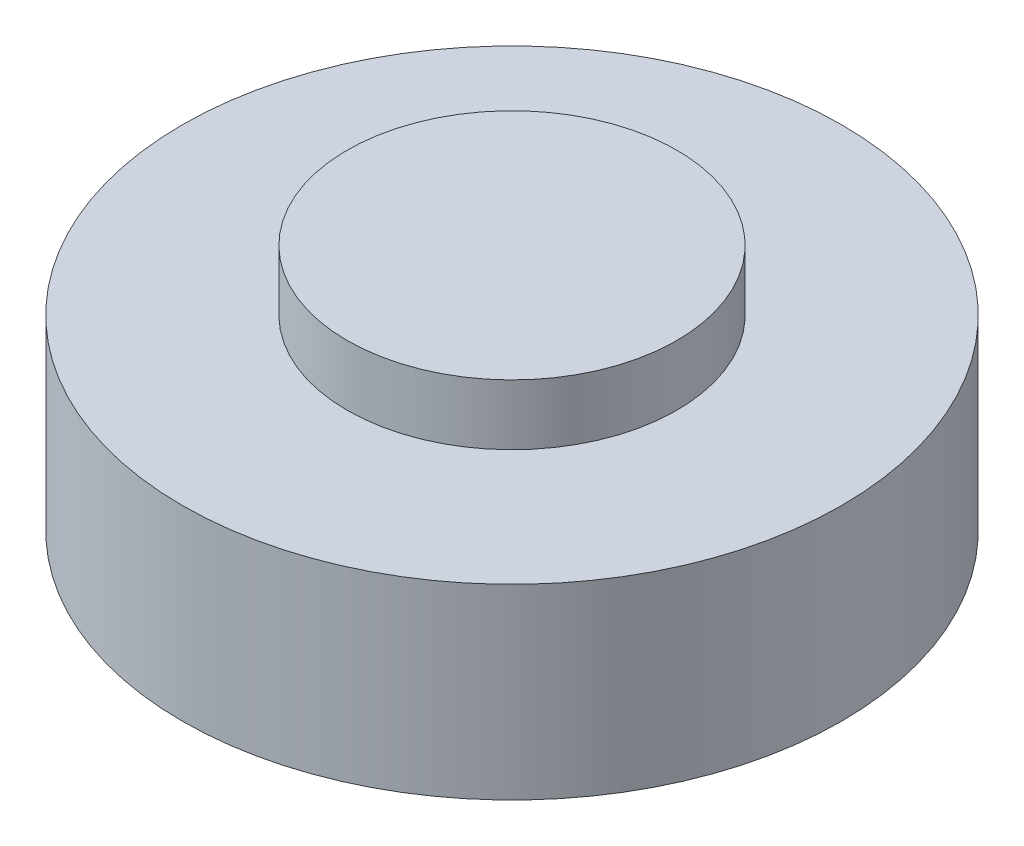
ISO-10303-21;
HEADER;
FILE_DESCRIPTION(('STEP AP214'),'2;1');
FILE_NAME('part.step','',(''),(''),'','','');
FILE_SCHEMA(('AUTOMOTIVE_DESIGN { 1 0 10303 214 1 1 1 1 }'));
ENDSEC;
DATA;
#1=APPLICATION_CONTEXT('core data for automotive mechanical design processes');
#2=APPLICATION_PROTOCOL_DEFINITION('international standard','automotive_design',2000,#1);
#3=PRODUCT_CONTEXT('',#1,'mechanical');
#4=PRODUCT('Part','Part','',(#3));
#5=PRODUCT_RELATED_PRODUCT_CATEGORY('part','',(#4));
#6=PRODUCT_DEFINITION_FORMATION('','',#4);
#7=PRODUCT_DEFINITION_CONTEXT('part definition',#1,'design');
#8=PRODUCT_DEFINITION('design','',#6,#7);
#9=PRODUCT_DEFINITION_SHAPE('','',#8);
#10=(LENGTH_UNIT() NAMED_UNIT(*) SI_UNIT(.MILLI.,.METRE.));
#11=(NAMED_UNIT(*) PLANE_ANGLE_UNIT() SI_UNIT($,.RADIAN.));
#12=(NAMED_UNIT(*) SI_UNIT($,.STERADIAN.) SOLID_ANGLE_UNIT());
#13=UNCERTAINTY_MEASURE_WITH_UNIT(LENGTH_MEASURE(1.E-05),#10,'distance_accuracy_value','');
#14=(GEOMETRIC_REPRESENTATION_CONTEXT(3) GLOBAL_UNCERTAINTY_ASSIGNED_CONTEXT((#13)) GLOBAL_UNIT_ASSIGNED_CONTEXT((#10,
#11,#12)) REPRESENTATION_CONTEXT('',''));
#15=CARTESIAN_POINT('',(0.,0.,0.));
#16=DIRECTION('',(0.,0.,1.));
#17=DIRECTION('',(1.,0.,0.));
#18=AXIS2_PLACEMENT_3D('',#15,#16,#17);
#19=CARTESIAN_POINT('',(0.,17.,0.));
#20=DIRECTION('',(0.,-1.,0.));
#21=DIRECTION('',(0.,0.,-1.));
#22=AXIS2_PLACEMENT_3D('',#19,#20,#21);
#23=CYLINDRICAL_SURFACE('',#22,30.);
#24=CARTESIAN_POINT('',(0.,17.,0.));
#25=DIRECTION('',(0.,1.,0.));
#26=DIRECTION('',(0.,0.,1.));
#27=AXIS2_PLACEMENT_3D('',#24,#25,#26);
#28=CIRCLE('',#27,30.);
#29=CARTESIAN_POINT('',(0.,17.,30.));
#30=VERTEX_POINT('',#29);
#31=EDGE_CURVE('E38',#30,#30,#28,.T.);
#32=ORIENTED_EDGE('',*,*,#31,.F.);
#33=EDGE_LOOP('',(#32));
#34=FACE_BOUND('',#33,.T.);
#35=CARTESIAN_POINT('',(0.,0.,0.));
#36=DIRECTION('',(0.,1.,0.));
#37=DIRECTION('',(0.,0.,1.));
#38=AXIS2_PLACEMENT_3D('',#35,#36,#37);
#39=CIRCLE('',#38,30.);
#40=CARTESIAN_POINT('',(0.,0.,30.));
#41=VERTEX_POINT('',#40);
#42=EDGE_CURVE('E34',#41,#41,#39,.T.);
#43=ORIENTED_EDGE('',*,*,#42,.T.);
#44=EDGE_LOOP('',(#43));
#45=FACE_BOUND('',#44,.T.);
#46=ADVANCED_FACE('F31',(#34,#45),#23,.T.);
#47=CARTESIAN_POINT('',(0.,17.,0.));
#48=DIRECTION('',(0.,1.,0.));
#49=DIRECTION('',(0.,0.,1.));
#50=AXIS2_PLACEMENT_3D('',#47,#48,#49);
#51=PLANE('',#50);
#52=CARTESIAN_POINT('',(0.,17.,0.));
#53=DIRECTION('',(0.,1.,0.));
#54=DIRECTION('',(0.,0.,1.));
#55=AXIS2_PLACEMENT_3D('',#52,#53,#54);
#56=CIRCLE('',#55,15.);
#57=CARTESIAN_POINT('',(0.,17.,15.));
#58=VERTEX_POINT('',#57);
#59=EDGE_CURVE('E10',#58,#58,#56,.T.);
#60=ORIENTED_EDGE('',*,*,#59,.F.);
#61=EDGE_LOOP('',(#60));
#62=FACE_BOUND('',#61,.T.);
#63=ORIENTED_EDGE('',*,*,#31,.T.);
#64=EDGE_LOOP('',(#63));
#65=FACE_BOUND('',#64,.T.);
#66=ADVANCED_FACE('F55',(#62,#65),#51,.T.);
#67=CARTESIAN_POINT('',(0.,0.,0.));
#68=DIRECTION('',(0.,1.,0.));
#69=DIRECTION('',(0.,0.,1.));
#70=AXIS2_PLACEMENT_3D('',#67,#68,#69);
#71=PLANE('',#70);
#72=ORIENTED_EDGE('',*,*,#42,.F.);
#73=EDGE_LOOP('',(#72));
#74=FACE_BOUND('',#73,.T.);
#75=ADVANCED_FACE('F52',(#74),#71,.F.);
#76=CARTESIAN_POINT('',(0.,22.5,0.));
#77=DIRECTION('',(0.,-1.,0.));
#78=DIRECTION('',(0.,0.,-1.));
#79=AXIS2_PLACEMENT_3D('',#76,#77,#78);
#80=CYLINDRICAL_SURFACE('',#79,15.);
#81=CARTESIAN_POINT('',(0.,22.5,0.));
#82=DIRECTION('',(0.,1.,0.));
#83=DIRECTION('',(0.,0.,1.));
#84=AXIS2_PLACEMENT_3D('',#81,#82,#83);
#85=CIRCLE('',#84,15.);
#86=CARTESIAN_POINT('',(0.,22.5,15.));
#87=VERTEX_POINT('',#86);
#88=EDGE_CURVE('E44',#87,#87,#85,.T.);
#89=ORIENTED_EDGE('',*,*,#88,.F.);
#90=EDGE_LOOP('',(#89));
#91=FACE_BOUND('',#90,.T.);
#92=ORIENTED_EDGE('',*,*,#59,.T.);
#93=EDGE_LOOP('',(#92));
#94=FACE_BOUND('',#93,.T.);
#95=ADVANCED_FACE('F54',(#91,#94),#80,.T.);
#96=CARTESIAN_POINT('',(0.,22.5,0.));
#97=DIRECTION('',(0.,1.,0.));
#98=DIRECTION('',(0.,0.,1.));
#99=AXIS2_PLACEMENT_3D('',#96,#97,#98);
#100=PLANE('',#99);
#101=ORIENTED_EDGE('',*,*,#88,.T.);
#102=EDGE_LOOP('',(#101));
#103=FACE_BOUND('',#102,.T.);
#104=ADVANCED_FACE('F60',(#103),#100,.T.);
#105=CLOSED_SHELL('',(#46,#66,#75,#95,#104));
#106=MANIFOLD_SOLID_BREP('B2',#105);
#107=ADVANCED_BREP_SHAPE_REPRESENTATION('',(#18,#106),#14);
#108=SHAPE_DEFINITION_REPRESENTATION(#9,#107);
ENDSEC;
END-ISO-10303-21;
